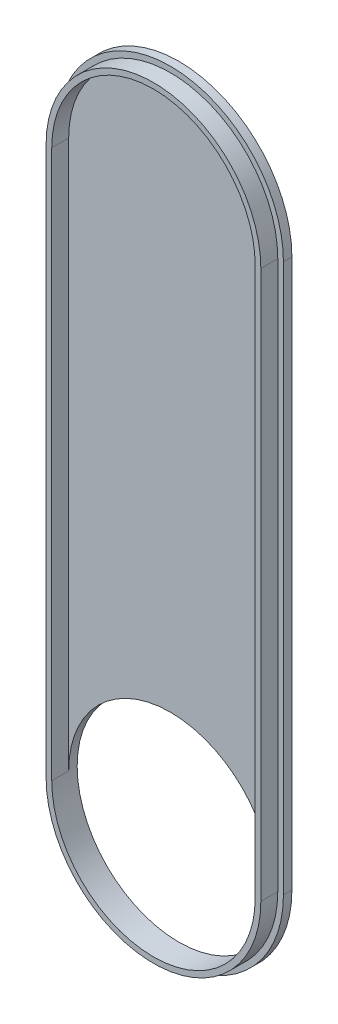
ISO-10303-21;
HEADER;
FILE_DESCRIPTION(('STEP AP214'),'2;1');
FILE_NAME('part.step','',(''),(''),'','','');
FILE_SCHEMA(('AUTOMOTIVE_DESIGN { 1 0 10303 214 1 1 1 1 }'));
ENDSEC;
DATA;
#1=APPLICATION_CONTEXT('core data for automotive mechanical design processes');
#2=APPLICATION_PROTOCOL_DEFINITION('international standard','automotive_design',2000,#1);
#3=PRODUCT_CONTEXT('',#1,'mechanical');
#4=PRODUCT('Part','Part','',(#3));
#5=PRODUCT_RELATED_PRODUCT_CATEGORY('part','',(#4));
#6=PRODUCT_DEFINITION_FORMATION('','',#4);
#7=PRODUCT_DEFINITION_CONTEXT('part definition',#1,'design');
#8=PRODUCT_DEFINITION('design','',#6,#7);
#9=PRODUCT_DEFINITION_SHAPE('','',#8);
#10=(LENGTH_UNIT() NAMED_UNIT(*) SI_UNIT(.MILLI.,.METRE.));
#11=(NAMED_UNIT(*) PLANE_ANGLE_UNIT() SI_UNIT($,.RADIAN.));
#12=(NAMED_UNIT(*) SI_UNIT($,.STERADIAN.) SOLID_ANGLE_UNIT());
#13=UNCERTAINTY_MEASURE_WITH_UNIT(LENGTH_MEASURE(1.E-05),#10,'distance_accuracy_value','');
#14=(GEOMETRIC_REPRESENTATION_CONTEXT(3) GLOBAL_UNCERTAINTY_ASSIGNED_CONTEXT((#13)) GLOBAL_UNIT_ASSIGNED_CONTEXT((#10,
#11,#12)) REPRESENTATION_CONTEXT('',''));
#15=CARTESIAN_POINT('',(0.,0.,0.));
#16=DIRECTION('',(0.,0.,1.));
#17=DIRECTION('',(1.,0.,0.));
#18=AXIS2_PLACEMENT_3D('',#15,#16,#17);
#19=CARTESIAN_POINT('',(0.,0.,1.5));
#20=DIRECTION('',(0.,0.,1.));
#21=DIRECTION('',(1.,0.,0.));
#22=AXIS2_PLACEMENT_3D('',#19,#20,#21);
#23=PLANE('',#22);
#24=CARTESIAN_POINT('',(0.,0.,1.5));
#25=DIRECTION('',(0.,0.,1.));
#26=DIRECTION('',(1.,0.,0.));
#27=AXIS2_PLACEMENT_3D('',#24,#25,#26);
#28=CIRCLE('',#27,20.);
#29=CARTESIAN_POINT('',(20.,0.,1.5));
#30=VERTEX_POINT('',#29);
#31=CARTESIAN_POINT('',(-20.,0.,1.5));
#32=VERTEX_POINT('',#31);
#33=EDGE_CURVE('E214',#30,#32,#28,.T.);
#34=ORIENTED_EDGE('',*,*,#33,.T.);
#35=DIRECTION('',(0.,-1.,0.));
#36=VECTOR('',#35,1.);
#37=CARTESIAN_POINT('',(-20.,0.,1.5));
#38=LINE('',#37,#36);
#39=CARTESIAN_POINT('',(-20.,-97.,1.5));
#40=VERTEX_POINT('',#39);
#41=EDGE_CURVE('E218',#32,#40,#38,.T.);
#42=ORIENTED_EDGE('',*,*,#41,.T.);
#43=CARTESIAN_POINT('',(0.,-97.,1.5));
#44=DIRECTION('',(0.,0.,1.));
#45=DIRECTION('',(1.,0.,0.));
#46=AXIS2_PLACEMENT_3D('',#43,#44,#45);
#47=CIRCLE('',#46,20.);
#48=CARTESIAN_POINT('',(20.,-97.,1.5));
#49=VERTEX_POINT('',#48);
#50=EDGE_CURVE('E222',#40,#49,#47,.T.);
#51=ORIENTED_EDGE('',*,*,#50,.T.);
#52=DIRECTION('',(0.,1.,0.));
#53=VECTOR('',#52,1.);
#54=CARTESIAN_POINT('',(20.,0.,1.5));
#55=LINE('',#54,#53);
#56=EDGE_CURVE('E225',#49,#30,#55,.T.);
#57=ORIENTED_EDGE('',*,*,#56,.T.);
#58=EDGE_LOOP('',(#34,#42,#51,#57));
#59=FACE_BOUND('',#58,.T.);
#60=DIRECTION('',(0.,1.,0.));
#61=VECTOR('',#60,1.);
#62=CARTESIAN_POINT('',(19.,-97.,1.5));
#63=LINE('',#62,#61);
#64=CARTESIAN_POINT('',(19.,-97.,1.5));
#65=VERTEX_POINT('',#64);
#66=CARTESIAN_POINT('',(19.,0.,1.5));
#67=VERTEX_POINT('',#66);
#68=EDGE_CURVE('E193',#65,#67,#63,.T.);
#69=ORIENTED_EDGE('',*,*,#68,.F.);
#70=CARTESIAN_POINT('',(0.,-97.,1.5));
#71=DIRECTION('',(0.,0.,1.));
#72=DIRECTION('',(1.,0.,0.));
#73=AXIS2_PLACEMENT_3D('',#70,#71,#72);
#74=CIRCLE('',#73,19.);
#75=CARTESIAN_POINT('',(-19.,-97.,1.5));
#76=VERTEX_POINT('',#75);
#77=EDGE_CURVE('E174',#76,#65,#74,.T.);
#78=ORIENTED_EDGE('',*,*,#77,.F.);
#79=DIRECTION('',(0.,-1.,0.));
#80=VECTOR('',#79,1.);
#81=CARTESIAN_POINT('',(-19.,0.,1.5));
#82=LINE('',#81,#80);
#83=CARTESIAN_POINT('',(-19.,0.,1.5));
#84=VERTEX_POINT('',#83);
#85=EDGE_CURVE('E180',#84,#76,#82,.T.);
#86=ORIENTED_EDGE('',*,*,#85,.F.);
#87=CARTESIAN_POINT('',(0.,0.,1.5));
#88=DIRECTION('',(0.,0.,1.));
#89=DIRECTION('',(1.,0.,0.));
#90=AXIS2_PLACEMENT_3D('',#87,#88,#89);
#91=CIRCLE('',#90,19.);
#92=EDGE_CURVE('E196',#67,#84,#91,.T.);
#93=ORIENTED_EDGE('',*,*,#92,.F.);
#94=EDGE_LOOP('',(#69,#78,#86,#93));
#95=FACE_BOUND('',#94,.T.);
#96=ADVANCED_FACE('F44',(#59,#95),#23,.T.);
#97=CARTESIAN_POINT('',(0.,0.,1.5));
#98=DIRECTION('',(0.,0.,-1.));
#99=DIRECTION('',(-1.,0.,0.));
#100=AXIS2_PLACEMENT_3D('',#97,#98,#99);
#101=CYLINDRICAL_SURFACE('',#100,20.);
#102=CARTESIAN_POINT('',(0.,0.,0.));
#103=DIRECTION('',(0.,0.,1.));
#104=DIRECTION('',(1.,0.,0.));
#105=AXIS2_PLACEMENT_3D('',#102,#103,#104);
#106=CIRCLE('',#105,20.);
#107=CARTESIAN_POINT('',(20.,0.,0.));
#108=VERTEX_POINT('',#107);
#109=CARTESIAN_POINT('',(-20.,0.,0.));
#110=VERTEX_POINT('',#109);
#111=EDGE_CURVE('E213',#108,#110,#106,.T.);
#112=ORIENTED_EDGE('',*,*,#111,.T.);
#113=DIRECTION('',(0.,0.,-1.));
#114=VECTOR('',#113,1.);
#115=CARTESIAN_POINT('',(-20.,0.,1.5));
#116=LINE('',#115,#114);
#117=EDGE_CURVE('E53',#32,#110,#116,.T.);
#118=ORIENTED_EDGE('',*,*,#117,.F.);
#119=ORIENTED_EDGE('',*,*,#33,.F.);
#120=DIRECTION('',(0.,0.,-1.));
#121=VECTOR('',#120,1.);
#122=CARTESIAN_POINT('',(20.,0.,1.5));
#123=LINE('',#122,#121);
#124=EDGE_CURVE('E228',#30,#108,#123,.T.);
#125=ORIENTED_EDGE('',*,*,#124,.T.);
#126=EDGE_LOOP('',(#112,#118,#119,#125));
#127=FACE_BOUND('',#126,.T.);
#128=ADVANCED_FACE('F46',(#127),#101,.T.);
#129=CARTESIAN_POINT('',(-20.,0.,1.5));
#130=DIRECTION('',(1.,0.,0.));
#131=DIRECTION('',(0.,1.,0.));
#132=AXIS2_PLACEMENT_3D('',#129,#130,#131);
#133=PLANE('',#132);
#134=DIRECTION('',(0.,-1.,0.));
#135=VECTOR('',#134,1.);
#136=CARTESIAN_POINT('',(-20.,0.,0.));
#137=LINE('',#136,#135);
#138=CARTESIAN_POINT('',(-20.,-97.,0.));
#139=VERTEX_POINT('',#138);
#140=EDGE_CURVE('E232',#110,#139,#137,.T.);
#141=ORIENTED_EDGE('',*,*,#140,.T.);
#142=DIRECTION('',(0.,0.,-1.));
#143=VECTOR('',#142,1.);
#144=CARTESIAN_POINT('',(-20.,-97.,1.5));
#145=LINE('',#144,#143);
#146=EDGE_CURVE('E247',#40,#139,#145,.T.);
#147=ORIENTED_EDGE('',*,*,#146,.F.);
#148=ORIENTED_EDGE('',*,*,#41,.F.);
#149=ORIENTED_EDGE('',*,*,#117,.T.);
#150=EDGE_LOOP('',(#141,#147,#148,#149));
#151=FACE_BOUND('',#150,.T.);
#152=ADVANCED_FACE('F254',(#151),#133,.F.);
#153=CARTESIAN_POINT('',(0.,-97.,1.5));
#154=DIRECTION('',(0.,0.,-1.));
#155=DIRECTION('',(-1.,0.,0.));
#156=AXIS2_PLACEMENT_3D('',#153,#154,#155);
#157=CYLINDRICAL_SURFACE('',#156,20.);
#158=CARTESIAN_POINT('',(0.,-97.,0.));
#159=DIRECTION('',(0.,0.,1.));
#160=DIRECTION('',(1.,0.,0.));
#161=AXIS2_PLACEMENT_3D('',#158,#159,#160);
#162=CIRCLE('',#161,20.);
#163=CARTESIAN_POINT('',(20.,-97.,0.));
#164=VERTEX_POINT('',#163);
#165=EDGE_CURVE('E235',#139,#164,#162,.T.);
#166=ORIENTED_EDGE('',*,*,#165,.T.);
#167=DIRECTION('',(0.,0.,-1.));
#168=VECTOR('',#167,1.);
#169=CARTESIAN_POINT('',(20.,-97.,1.5));
#170=LINE('',#169,#168);
#171=EDGE_CURVE('E243',#49,#164,#170,.T.);
#172=ORIENTED_EDGE('',*,*,#171,.F.);
#173=ORIENTED_EDGE('',*,*,#50,.F.);
#174=ORIENTED_EDGE('',*,*,#146,.T.);
#175=EDGE_LOOP('',(#166,#172,#173,#174));
#176=FACE_BOUND('',#175,.T.);
#177=ADVANCED_FACE('F266',(#176),#157,.T.);
#178=CARTESIAN_POINT('',(20.,0.,1.5));
#179=DIRECTION('',(-1.,0.,0.));
#180=DIRECTION('',(0.,-1.,0.));
#181=AXIS2_PLACEMENT_3D('',#178,#179,#180);
#182=PLANE('',#181);
#183=DIRECTION('',(0.,1.,0.));
#184=VECTOR('',#183,1.);
#185=CARTESIAN_POINT('',(20.,0.,0.));
#186=LINE('',#185,#184);
#187=EDGE_CURVE('E219',#164,#108,#186,.T.);
#188=ORIENTED_EDGE('',*,*,#187,.T.);
#189=ORIENTED_EDGE('',*,*,#124,.F.);
#190=ORIENTED_EDGE('',*,*,#56,.F.);
#191=ORIENTED_EDGE('',*,*,#171,.T.);
#192=EDGE_LOOP('',(#188,#189,#190,#191));
#193=FACE_BOUND('',#192,.T.);
#194=ADVANCED_FACE('F270',(#193),#182,.F.);
#195=CARTESIAN_POINT('',(0.,0.,0.));
#196=DIRECTION('',(0.,0.,1.));
#197=DIRECTION('',(1.,0.,0.));
#198=AXIS2_PLACEMENT_3D('',#195,#196,#197);
#199=PLANE('',#198);
#200=CARTESIAN_POINT('',(0.,-97.,0.));
#201=DIRECTION('',(0.,0.,-1.));
#202=DIRECTION('',(-1.,0.,0.));
#203=AXIS2_PLACEMENT_3D('',#200,#201,#202);
#204=CIRCLE('',#203,18.);
#205=CARTESIAN_POINT('',(-18.,-97.,0.));
#206=VERTEX_POINT('',#205);
#207=EDGE_CURVE('E436',#206,#206,#204,.T.);
#208=ORIENTED_EDGE('',*,*,#207,.F.);
#209=EDGE_LOOP('',(#208));
#210=FACE_BOUND('',#209,.T.);
#211=ORIENTED_EDGE('',*,*,#111,.F.);
#212=ORIENTED_EDGE('',*,*,#187,.F.);
#213=ORIENTED_EDGE('',*,*,#165,.F.);
#214=ORIENTED_EDGE('',*,*,#140,.F.);
#215=EDGE_LOOP('',(#211,#212,#213,#214));
#216=FACE_BOUND('',#215,.T.);
#217=ADVANCED_FACE('F262',(#210,#216),#199,.F.);
#218=CARTESIAN_POINT('',(0.,-97.,4.5));
#219=DIRECTION('',(0.,0.,1.));
#220=DIRECTION('',(1.,0.,0.));
#221=AXIS2_PLACEMENT_3D('',#218,#219,#220);
#222=PLANE('',#221);
#223=CARTESIAN_POINT('',(0.,-97.,4.5));
#224=DIRECTION('',(0.,0.,1.));
#225=DIRECTION('',(1.,0.,0.));
#226=AXIS2_PLACEMENT_3D('',#223,#224,#225);
#227=CIRCLE('',#226,19.);
#228=CARTESIAN_POINT('',(-19.,-97.,4.5));
#229=VERTEX_POINT('',#228);
#230=CARTESIAN_POINT('',(19.,-97.,4.5));
#231=VERTEX_POINT('',#230);
#232=EDGE_CURVE('E175',#229,#231,#227,.T.);
#233=ORIENTED_EDGE('',*,*,#232,.T.);
#234=DIRECTION('',(0.,1.,0.));
#235=VECTOR('',#234,1.);
#236=CARTESIAN_POINT('',(19.,-97.,4.5));
#237=LINE('',#236,#235);
#238=CARTESIAN_POINT('',(19.,0.,4.5));
#239=VERTEX_POINT('',#238);
#240=EDGE_CURVE('E179',#231,#239,#237,.T.);
#241=ORIENTED_EDGE('',*,*,#240,.T.);
#242=CARTESIAN_POINT('',(0.,0.,4.5));
#243=DIRECTION('',(0.,0.,1.));
#244=DIRECTION('',(1.,0.,0.));
#245=AXIS2_PLACEMENT_3D('',#242,#243,#244);
#246=CIRCLE('',#245,19.);
#247=CARTESIAN_POINT('',(-19.,0.,4.5));
#248=VERTEX_POINT('',#247);
#249=EDGE_CURVE('E183',#239,#248,#246,.T.);
#250=ORIENTED_EDGE('',*,*,#249,.T.);
#251=DIRECTION('',(0.,-1.,0.));
#252=VECTOR('',#251,1.);
#253=CARTESIAN_POINT('',(-19.,0.,4.5));
#254=LINE('',#253,#252);
#255=EDGE_CURVE('E186',#248,#229,#254,.T.);
#256=ORIENTED_EDGE('',*,*,#255,.T.);
#257=EDGE_LOOP('',(#233,#241,#250,#256));
#258=FACE_BOUND('',#257,.T.);
#259=DIRECTION('',(0.,-1.,0.));
#260=VECTOR('',#259,1.);
#261=CARTESIAN_POINT('',(-18.,0.,4.5));
#262=LINE('',#261,#260);
#263=CARTESIAN_POINT('',(-18.,0.,4.5));
#264=VERTEX_POINT('',#263);
#265=CARTESIAN_POINT('',(-18.,-97.,4.5));
#266=VERTEX_POINT('',#265);
#267=EDGE_CURVE('E160',#264,#266,#262,.T.);
#268=ORIENTED_EDGE('',*,*,#267,.F.);
#269=CARTESIAN_POINT('',(0.,0.,4.5));
#270=DIRECTION('',(0.,0.,1.));
#271=DIRECTION('',(1.,0.,0.));
#272=AXIS2_PLACEMENT_3D('',#269,#270,#271);
#273=CIRCLE('',#272,18.);
#274=CARTESIAN_POINT('',(18.,0.,4.5));
#275=VERTEX_POINT('',#274);
#276=EDGE_CURVE('E156',#275,#264,#273,.T.);
#277=ORIENTED_EDGE('',*,*,#276,.F.);
#278=DIRECTION('',(0.,1.,0.));
#279=VECTOR('',#278,1.);
#280=CARTESIAN_POINT('',(18.,-97.,4.5));
#281=LINE('',#280,#279);
#282=CARTESIAN_POINT('',(18.,-97.,4.5));
#283=VERTEX_POINT('',#282);
#284=EDGE_CURVE('E166',#283,#275,#281,.T.);
#285=ORIENTED_EDGE('',*,*,#284,.F.);
#286=CARTESIAN_POINT('',(0.,-97.,4.5));
#287=DIRECTION('',(0.,0.,1.));
#288=DIRECTION('',(1.,0.,0.));
#289=AXIS2_PLACEMENT_3D('',#286,#287,#288);
#290=CIRCLE('',#289,18.);
#291=EDGE_CURVE('E145',#266,#283,#290,.T.);
#292=ORIENTED_EDGE('',*,*,#291,.F.);
#293=EDGE_LOOP('',(#268,#277,#285,#292));
#294=FACE_BOUND('',#293,.T.);
#295=ADVANCED_FACE('F287',(#258,#294),#222,.T.);
#296=CARTESIAN_POINT('',(0.,-97.,4.5));
#297=DIRECTION('',(0.,0.,-1.));
#298=DIRECTION('',(-1.,0.,0.));
#299=AXIS2_PLACEMENT_3D('',#296,#297,#298);
#300=CYLINDRICAL_SURFACE('',#299,19.);
#301=ORIENTED_EDGE('',*,*,#77,.T.);
#302=DIRECTION('',(0.,0.,-1.));
#303=VECTOR('',#302,1.);
#304=CARTESIAN_POINT('',(19.,-97.,4.5));
#305=LINE('',#304,#303);
#306=EDGE_CURVE('E210',#231,#65,#305,.T.);
#307=ORIENTED_EDGE('',*,*,#306,.F.);
#308=ORIENTED_EDGE('',*,*,#232,.F.);
#309=DIRECTION('',(0.,0.,-1.));
#310=VECTOR('',#309,1.);
#311=CARTESIAN_POINT('',(-19.,-97.,4.5));
#312=LINE('',#311,#310);
#313=EDGE_CURVE('E189',#229,#76,#312,.T.);
#314=ORIENTED_EDGE('',*,*,#313,.T.);
#315=EDGE_LOOP('',(#301,#307,#308,#314));
#316=FACE_BOUND('',#315,.T.);
#317=ADVANCED_FACE('F292',(#316),#300,.T.);
#318=CARTESIAN_POINT('',(19.,-97.,4.5));
#319=DIRECTION('',(-1.,0.,0.));
#320=DIRECTION('',(0.,-1.,0.));
#321=AXIS2_PLACEMENT_3D('',#318,#319,#320);
#322=PLANE('',#321);
#323=ORIENTED_EDGE('',*,*,#68,.T.);
#324=DIRECTION('',(0.,0.,-1.));
#325=VECTOR('',#324,1.);
#326=CARTESIAN_POINT('',(19.,0.,4.5));
#327=LINE('',#326,#325);
#328=EDGE_CURVE('E206',#239,#67,#327,.T.);
#329=ORIENTED_EDGE('',*,*,#328,.F.);
#330=ORIENTED_EDGE('',*,*,#240,.F.);
#331=ORIENTED_EDGE('',*,*,#306,.T.);
#332=EDGE_LOOP('',(#323,#329,#330,#331));
#333=FACE_BOUND('',#332,.T.);
#334=ADVANCED_FACE('F281',(#333),#322,.F.);
#335=CARTESIAN_POINT('',(0.,0.,4.5));
#336=DIRECTION('',(0.,0.,-1.));
#337=DIRECTION('',(-1.,0.,0.));
#338=AXIS2_PLACEMENT_3D('',#335,#336,#337);
#339=CYLINDRICAL_SURFACE('',#338,19.);
#340=ORIENTED_EDGE('',*,*,#92,.T.);
#341=DIRECTION('',(0.,0.,-1.));
#342=VECTOR('',#341,1.);
#343=CARTESIAN_POINT('',(-19.,0.,4.5));
#344=LINE('',#343,#342);
#345=EDGE_CURVE('E60',#248,#84,#344,.T.);
#346=ORIENTED_EDGE('',*,*,#345,.F.);
#347=ORIENTED_EDGE('',*,*,#249,.F.);
#348=ORIENTED_EDGE('',*,*,#328,.T.);
#349=EDGE_LOOP('',(#340,#346,#347,#348));
#350=FACE_BOUND('',#349,.T.);
#351=ADVANCED_FACE('F285',(#350),#339,.T.);
#352=CARTESIAN_POINT('',(-19.,0.,4.5));
#353=DIRECTION('',(1.,0.,0.));
#354=DIRECTION('',(0.,1.,0.));
#355=AXIS2_PLACEMENT_3D('',#352,#353,#354);
#356=PLANE('',#355);
#357=ORIENTED_EDGE('',*,*,#85,.T.);
#358=ORIENTED_EDGE('',*,*,#313,.F.);
#359=ORIENTED_EDGE('',*,*,#255,.F.);
#360=ORIENTED_EDGE('',*,*,#345,.T.);
#361=EDGE_LOOP('',(#357,#358,#359,#360));
#362=FACE_BOUND('',#361,.T.);
#363=ADVANCED_FACE('F293',(#362),#356,.F.);
#364=CARTESIAN_POINT('',(0.,0.,4.5));
#365=DIRECTION('',(0.,0.,-1.));
#366=DIRECTION('',(-1.,0.,0.));
#367=AXIS2_PLACEMENT_3D('',#364,#365,#366);
#368=CYLINDRICAL_SURFACE('',#367,18.);
#369=CARTESIAN_POINT('',(0.,0.,1.5));
#370=DIRECTION('',(0.,0.,1.));
#371=DIRECTION('',(1.,0.,0.));
#372=AXIS2_PLACEMENT_3D('',#369,#370,#371);
#373=CIRCLE('',#372,18.);
#374=CARTESIAN_POINT('',(18.,0.,1.5));
#375=VERTEX_POINT('',#374);
#376=CARTESIAN_POINT('',(-18.,0.,1.5));
#377=VERTEX_POINT('',#376);
#378=EDGE_CURVE('E68',#375,#377,#373,.T.);
#379=ORIENTED_EDGE('',*,*,#378,.F.);
#380=DIRECTION('',(0.,0.,-1.));
#381=VECTOR('',#380,1.);
#382=CARTESIAN_POINT('',(18.,0.,4.5));
#383=LINE('',#382,#381);
#384=EDGE_CURVE('E150',#275,#375,#383,.T.);
#385=ORIENTED_EDGE('',*,*,#384,.F.);
#386=ORIENTED_EDGE('',*,*,#276,.T.);
#387=DIRECTION('',(0.,0.,-1.));
#388=VECTOR('',#387,1.);
#389=CARTESIAN_POINT('',(-18.,0.,4.5));
#390=LINE('',#389,#388);
#391=EDGE_CURVE('E170',#264,#377,#390,.T.);
#392=ORIENTED_EDGE('',*,*,#391,.T.);
#393=EDGE_LOOP('',(#379,#385,#386,#392));
#394=FACE_BOUND('',#393,.T.);
#395=ADVANCED_FACE('F295',(#394),#368,.F.);
#396=CARTESIAN_POINT('',(-18.,0.,4.5));
#397=DIRECTION('',(1.,0.,0.));
#398=DIRECTION('',(0.,1.,0.));
#399=AXIS2_PLACEMENT_3D('',#396,#397,#398);
#400=PLANE('',#399);
#401=DIRECTION('',(0.,-1.,0.));
#402=VECTOR('',#401,1.);
#403=CARTESIAN_POINT('',(-18.,0.,1.5));
#404=LINE('',#403,#402);
#405=CARTESIAN_POINT('',(-18.,-97.,1.5));
#406=VERTEX_POINT('',#405);
#407=EDGE_CURVE('E136',#377,#406,#404,.T.);
#408=ORIENTED_EDGE('',*,*,#407,.F.);
#409=ORIENTED_EDGE('',*,*,#391,.F.);
#410=ORIENTED_EDGE('',*,*,#267,.T.);
#411=DIRECTION('',(0.,0.,-1.));
#412=VECTOR('',#411,1.);
#413=CARTESIAN_POINT('',(-18.,-97.,4.5));
#414=LINE('',#413,#412);
#415=EDGE_CURVE('E149',#266,#406,#414,.T.);
#416=ORIENTED_EDGE('',*,*,#415,.T.);
#417=EDGE_LOOP('',(#408,#409,#410,#416));
#418=FACE_BOUND('',#417,.T.);
#419=ADVANCED_FACE('F301',(#418),#400,.T.);
#420=CARTESIAN_POINT('',(0.,-97.,4.5));
#421=DIRECTION('',(0.,0.,-1.));
#422=DIRECTION('',(-1.,0.,0.));
#423=AXIS2_PLACEMENT_3D('',#420,#421,#422);
#424=CYLINDRICAL_SURFACE('',#423,18.);
#425=DIRECTION('',(0.,0.,-1.));
#426=VECTOR('',#425,1.);
#427=CARTESIAN_POINT('',(18.,-97.,4.5));
#428=LINE('',#427,#426);
#429=CARTESIAN_POINT('',(18.,-97.,1.5));
#430=VERTEX_POINT('',#429);
#431=EDGE_CURVE('E141',#283,#430,#428,.T.);
#432=ORIENTED_EDGE('',*,*,#431,.T.);
#433=CARTESIAN_POINT('',(0.,-97.,1.5));
#434=DIRECTION('',(0.,0.,1.));
#435=DIRECTION('',(1.,0.,0.));
#436=AXIS2_PLACEMENT_3D('',#433,#434,#435);
#437=CIRCLE('',#436,18.);
#438=EDGE_CURVE('E11',#430,#406,#437,.T.);
#439=ORIENTED_EDGE('',*,*,#438,.T.);
#440=ORIENTED_EDGE('',*,*,#415,.F.);
#441=ORIENTED_EDGE('',*,*,#291,.T.);
#442=EDGE_LOOP('',(#432,#439,#440,#441));
#443=FACE_BOUND('',#442,.T.);
#444=ORIENTED_EDGE('',*,*,#207,.T.);
#445=EDGE_LOOP('',(#444));
#446=FACE_BOUND('',#445,.T.);
#447=ADVANCED_FACE('F142',(#443,#446),#424,.F.);
#448=CARTESIAN_POINT('',(18.,-97.,4.5));
#449=DIRECTION('',(-1.,0.,0.));
#450=DIRECTION('',(0.,-1.,0.));
#451=AXIS2_PLACEMENT_3D('',#448,#449,#450);
#452=PLANE('',#451);
#453=DIRECTION('',(0.,1.,0.));
#454=VECTOR('',#453,1.);
#455=CARTESIAN_POINT('',(18.,-97.,1.5));
#456=LINE('',#455,#454);
#457=EDGE_CURVE('E135',#430,#375,#456,.T.);
#458=ORIENTED_EDGE('',*,*,#457,.F.);
#459=ORIENTED_EDGE('',*,*,#431,.F.);
#460=ORIENTED_EDGE('',*,*,#284,.T.);
#461=ORIENTED_EDGE('',*,*,#384,.T.);
#462=EDGE_LOOP('',(#458,#459,#460,#461));
#463=FACE_BOUND('',#462,.T.);
#464=ADVANCED_FACE('F153',(#463),#452,.T.);
#465=ORIENTED_EDGE('',*,*,#438,.F.);
#466=ORIENTED_EDGE('',*,*,#457,.T.);
#467=ORIENTED_EDGE('',*,*,#378,.T.);
#468=ORIENTED_EDGE('',*,*,#407,.T.);
#469=EDGE_LOOP('',(#465,#466,#467,#468));
#470=FACE_BOUND('',#469,.T.);
#471=ADVANCED_FACE('F133',(#470),#23,.T.);
#472=CLOSED_SHELL('',(#96,#128,#152,#177,#194,#217,#295,#317,#334,#351,#363,#395,#419,#447,#464,#471));
#473=MANIFOLD_SOLID_BREP('B2',#472);
#474=ADVANCED_BREP_SHAPE_REPRESENTATION('',(#18,#473),#14);
#475=SHAPE_DEFINITION_REPRESENTATION(#9,#474);
ENDSEC;
END-ISO-10303-21;
